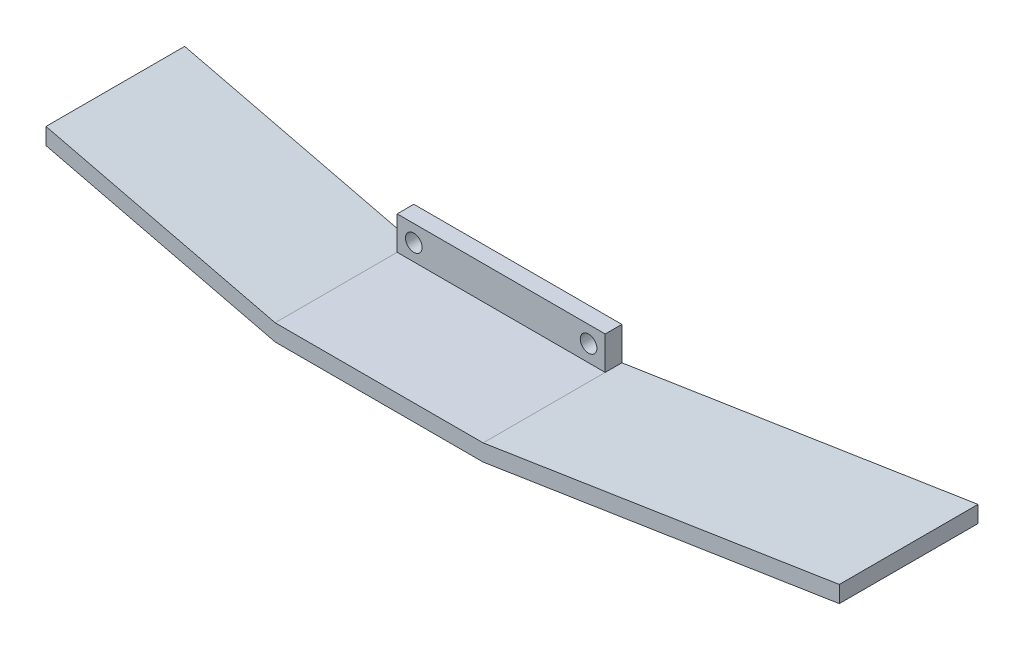
ISO-10303-21;
HEADER;
FILE_DESCRIPTION(('STEP AP214'),'2;1');
FILE_NAME('part.step','',(''),(''),'','','');
FILE_SCHEMA(('AUTOMOTIVE_DESIGN { 1 0 10303 214 1 1 1 1 }'));
ENDSEC;
DATA;
#1=APPLICATION_CONTEXT('core data for automotive mechanical design processes');
#2=APPLICATION_PROTOCOL_DEFINITION('international standard','automotive_design',2000,#1);
#3=PRODUCT_CONTEXT('',#1,'mechanical');
#4=PRODUCT('Part','Part','',(#3));
#5=PRODUCT_RELATED_PRODUCT_CATEGORY('part','',(#4));
#6=PRODUCT_DEFINITION_FORMATION('','',#4);
#7=PRODUCT_DEFINITION_CONTEXT('part definition',#1,'design');
#8=PRODUCT_DEFINITION('design','',#6,#7);
#9=PRODUCT_DEFINITION_SHAPE('','',#8);
#10=(LENGTH_UNIT() NAMED_UNIT(*) SI_UNIT(.MILLI.,.METRE.));
#11=(NAMED_UNIT(*) PLANE_ANGLE_UNIT() SI_UNIT($,.RADIAN.));
#12=(NAMED_UNIT(*) SI_UNIT($,.STERADIAN.) SOLID_ANGLE_UNIT());
#13=UNCERTAINTY_MEASURE_WITH_UNIT(LENGTH_MEASURE(1.E-05),#10,'distance_accuracy_value','');
#14=(GEOMETRIC_REPRESENTATION_CONTEXT(3) GLOBAL_UNCERTAINTY_ASSIGNED_CONTEXT((#13)) GLOBAL_UNIT_ASSIGNED_CONTEXT((#10,
#11,#12)) REPRESENTATION_CONTEXT('',''));
#15=CARTESIAN_POINT('',(0.,0.,0.));
#16=DIRECTION('',(0.,0.,1.));
#17=DIRECTION('',(1.,0.,0.));
#18=AXIS2_PLACEMENT_3D('',#15,#16,#17);
#19=CARTESIAN_POINT('',(101.7,4.70457006684912E-13,25.));
#20=DIRECTION('',(1.,0.,0.));
#21=DIRECTION('',(0.,1.,0.));
#22=AXIS2_PLACEMENT_3D('',#19,#20,#21);
#23=PLANE('',#22);
#24=DIRECTION('',(0.,-1.,0.));
#25=VECTOR('',#24,1.);
#26=CARTESIAN_POINT('',(101.7,4.70457006684912E-13,0.));
#27=LINE('',#26,#25);
#28=CARTESIAN_POINT('',(101.7,13.,0.));
#29=VERTEX_POINT('',#28);
#30=CARTESIAN_POINT('',(101.7,10.,0.));
#31=VERTEX_POINT('',#30);
#32=EDGE_CURVE('E133',#29,#31,#27,.T.);
#33=ORIENTED_EDGE('',*,*,#32,.F.);
#34=DIRECTION('',(0.,0.,-1.));
#35=VECTOR('',#34,1.);
#36=CARTESIAN_POINT('',(101.7,13.,25.));
#37=LINE('',#36,#35);
#38=CARTESIAN_POINT('',(101.7,13.,25.));
#39=VERTEX_POINT('',#38);
#40=EDGE_CURVE('E11',#39,#29,#37,.T.);
#41=ORIENTED_EDGE('',*,*,#40,.F.);
#42=DIRECTION('',(0.,-1.,0.));
#43=VECTOR('',#42,1.);
#44=CARTESIAN_POINT('',(101.7,4.70457006684912E-13,25.));
#45=LINE('',#44,#43);
#46=CARTESIAN_POINT('',(101.7,10.,25.));
#47=VERTEX_POINT('',#46);
#48=EDGE_CURVE('E149',#39,#47,#45,.T.);
#49=ORIENTED_EDGE('',*,*,#48,.T.);
#50=DIRECTION('',(0.,0.,-1.));
#51=VECTOR('',#50,1.);
#52=CARTESIAN_POINT('',(101.7,10.,25.));
#53=LINE('',#52,#51);
#54=EDGE_CURVE('E87',#47,#31,#53,.T.);
#55=ORIENTED_EDGE('',*,*,#54,.T.);
#56=EDGE_LOOP('',(#33,#41,#49,#55));
#57=FACE_BOUND('',#56,.T.);
#58=ADVANCED_FACE('F37',(#57),#23,.T.);
#59=CARTESIAN_POINT('',(0.432059578741914,-2.77382249552309,25.));
#60=DIRECTION('',(-0.153907364686392,0.988085281286636,0.));
#61=DIRECTION('',(-0.988085281286636,-0.153907364686392,0.));
#62=AXIS2_PLACEMENT_3D('',#59,#60,#61);
#63=PLANE('',#62);
#64=DIRECTION('',(0.988085281286636,0.153907364686392,0.));
#65=VECTOR('',#64,1.);
#66=CARTESIAN_POINT('',(0.432059578741914,-2.77382249552309,0.));
#67=LINE('',#66,#65);
#68=CARTESIAN_POINT('',(37.5,2.99999999999999,0.));
#69=VERTEX_POINT('',#68);
#70=EDGE_CURVE('E136',#69,#29,#67,.T.);
#71=ORIENTED_EDGE('',*,*,#70,.F.);
#72=DIRECTION('',(0.,0.,-1.));
#73=VECTOR('',#72,1.);
#74=CARTESIAN_POINT('',(37.5,2.99999999999999,3.));
#75=LINE('',#74,#73);
#76=CARTESIAN_POINT('',(37.5,2.99999999999999,3.));
#77=VERTEX_POINT('',#76);
#78=EDGE_CURVE('E200',#77,#69,#75,.T.);
#79=ORIENTED_EDGE('',*,*,#78,.F.);
#80=DIRECTION('',(0.,0.,-1.));
#81=VECTOR('',#80,1.);
#82=CARTESIAN_POINT('',(37.5,2.99999999999999,25.));
#83=LINE('',#82,#81);
#84=CARTESIAN_POINT('',(37.5,2.99999999999999,25.));
#85=VERTEX_POINT('',#84);
#86=EDGE_CURVE('E46',#85,#77,#83,.T.);
#87=ORIENTED_EDGE('',*,*,#86,.F.);
#88=DIRECTION('',(0.988085281286636,0.153907364686392,0.));
#89=VECTOR('',#88,1.);
#90=CARTESIAN_POINT('',(0.432059578741914,-2.77382249552309,25.));
#91=LINE('',#90,#89);
#92=EDGE_CURVE('E206',#85,#39,#91,.T.);
#93=ORIENTED_EDGE('',*,*,#92,.T.);
#94=ORIENTED_EDGE('',*,*,#40,.T.);
#95=EDGE_LOOP('',(#71,#79,#87,#93,#94));
#96=FACE_BOUND('',#95,.T.);
#97=ADVANCED_FACE('F228',(#96),#63,.T.);
#98=CARTESIAN_POINT('',(0.,2.99999999999999,25.));
#99=DIRECTION('',(0.,1.,0.));
#100=DIRECTION('',(0.,0.,1.));
#101=AXIS2_PLACEMENT_3D('',#98,#99,#100);
#102=PLANE('',#101);
#103=DIRECTION('',(1.,0.,0.));
#104=VECTOR('',#103,1.);
#105=CARTESIAN_POINT('',(0.,2.99999999999999,3.));
#106=LINE('',#105,#104);
#107=CARTESIAN_POINT('',(0.,2.99999999999999,3.));
#108=VERTEX_POINT('',#107);
#109=EDGE_CURVE('E178',#108,#77,#106,.T.);
#110=ORIENTED_EDGE('',*,*,#109,.F.);
#111=DIRECTION('',(0.,0.,-1.));
#112=VECTOR('',#111,1.);
#113=CARTESIAN_POINT('',(0.,2.99999999999999,25.));
#114=LINE('',#113,#112);
#115=CARTESIAN_POINT('',(0.,2.99999999999999,25.));
#116=VERTEX_POINT('',#115);
#117=EDGE_CURVE('E156',#116,#108,#114,.T.);
#118=ORIENTED_EDGE('',*,*,#117,.F.);
#119=DIRECTION('',(1.,0.,0.));
#120=VECTOR('',#119,1.);
#121=CARTESIAN_POINT('',(0.,2.99999999999999,25.));
#122=LINE('',#121,#120);
#123=EDGE_CURVE('E209',#116,#85,#122,.T.);
#124=ORIENTED_EDGE('',*,*,#123,.T.);
#125=ORIENTED_EDGE('',*,*,#86,.T.);
#126=EDGE_LOOP('',(#110,#118,#124,#125));
#127=FACE_BOUND('',#126,.T.);
#128=ADVANCED_FACE('F233',(#127),#102,.T.);
#129=CARTESIAN_POINT('',(0.686164291766578,2.83385852499597,25.));
#130=DIRECTION('',(-0.235330600789623,-0.971915381261144,0.));
#131=DIRECTION('',(0.971915381261144,-0.235330600789623,0.));
#132=AXIS2_PLACEMENT_3D('',#129,#130,#131);
#133=PLANE('',#132);
#134=DIRECTION('',(-0.971915381261144,0.235330600789623,0.));
#135=VECTOR('',#134,1.);
#136=CARTESIAN_POINT('',(0.686164291766578,2.83385852499597,0.));
#137=LINE('',#136,#135);
#138=CARTESIAN_POINT('',(0.,2.99999999999999,0.));
#139=VERTEX_POINT('',#138);
#140=CARTESIAN_POINT('',(-41.3000000000001,13.,0.));
#141=VERTEX_POINT('',#140);
#142=EDGE_CURVE('E140',#139,#141,#137,.T.);
#143=ORIENTED_EDGE('',*,*,#142,.T.);
#144=DIRECTION('',(0.,0.,-1.));
#145=VECTOR('',#144,1.);
#146=CARTESIAN_POINT('',(-41.3000000000001,13.,25.));
#147=LINE('',#146,#145);
#148=CARTESIAN_POINT('',(-41.3000000000001,13.,25.));
#149=VERTEX_POINT('',#148);
#150=EDGE_CURVE('E153',#149,#141,#147,.T.);
#151=ORIENTED_EDGE('',*,*,#150,.F.);
#152=DIRECTION('',(-0.971915381261144,0.235330600789623,0.));
#153=VECTOR('',#152,1.);
#154=CARTESIAN_POINT('',(0.686164291766578,2.83385852499597,25.));
#155=LINE('',#154,#153);
#156=EDGE_CURVE('E128',#116,#149,#155,.T.);
#157=ORIENTED_EDGE('',*,*,#156,.F.);
#158=ORIENTED_EDGE('',*,*,#117,.T.);
#159=DIRECTION('',(0.,0.,-1.));
#160=VECTOR('',#159,1.);
#161=CARTESIAN_POINT('',(0.,2.99999999999999,3.));
#162=LINE('',#161,#160);
#163=EDGE_CURVE('E137',#108,#139,#162,.T.);
#164=ORIENTED_EDGE('',*,*,#163,.T.);
#165=EDGE_LOOP('',(#143,#151,#157,#158,#164));
#166=FACE_BOUND('',#165,.T.);
#167=ADVANCED_FACE('F216',(#166),#133,.F.);
#168=CARTESIAN_POINT('',(-41.3,0.,25.));
#169=DIRECTION('',(1.,0.,0.));
#170=DIRECTION('',(0.,1.,0.));
#171=AXIS2_PLACEMENT_3D('',#168,#169,#170);
#172=PLANE('',#171);
#173=DIRECTION('',(0.,-1.,0.));
#174=VECTOR('',#173,1.);
#175=CARTESIAN_POINT('',(-41.3,0.,0.));
#176=LINE('',#175,#174);
#177=CARTESIAN_POINT('',(-41.3000000000001,10.,0.));
#178=VERTEX_POINT('',#177);
#179=EDGE_CURVE('E142',#141,#178,#176,.T.);
#180=ORIENTED_EDGE('',*,*,#179,.T.);
#181=DIRECTION('',(0.,0.,-1.));
#182=VECTOR('',#181,1.);
#183=CARTESIAN_POINT('',(-41.3000000000001,10.,25.));
#184=LINE('',#183,#182);
#185=CARTESIAN_POINT('',(-41.3000000000001,10.,25.));
#186=VERTEX_POINT('',#185);
#187=EDGE_CURVE('E117',#186,#178,#184,.T.);
#188=ORIENTED_EDGE('',*,*,#187,.F.);
#189=DIRECTION('',(0.,-1.,0.));
#190=VECTOR('',#189,1.);
#191=CARTESIAN_POINT('',(-41.3,0.,25.));
#192=LINE('',#191,#190);
#193=EDGE_CURVE('E125',#149,#186,#192,.T.);
#194=ORIENTED_EDGE('',*,*,#193,.F.);
#195=ORIENTED_EDGE('',*,*,#150,.T.);
#196=EDGE_LOOP('',(#180,#188,#194,#195));
#197=FACE_BOUND('',#196,.T.);
#198=ADVANCED_FACE('F220',(#197),#172,.F.);
#199=CARTESIAN_POINT('',(0.,0.,25.));
#200=DIRECTION('',(-0.235330600789623,-0.971915381261144,0.));
#201=DIRECTION('',(0.971915381261144,-0.235330600789623,0.));
#202=AXIS2_PLACEMENT_3D('',#199,#200,#201);
#203=PLANE('',#202);
#204=DIRECTION('',(-0.971915381261144,0.235330600789623,0.));
#205=VECTOR('',#204,1.);
#206=CARTESIAN_POINT('',(0.,0.,0.));
#207=LINE('',#206,#205);
#208=CARTESIAN_POINT('',(0.,0.,0.));
#209=VERTEX_POINT('',#208);
#210=EDGE_CURVE('E116',#209,#178,#207,.T.);
#211=ORIENTED_EDGE('',*,*,#210,.F.);
#212=DIRECTION('',(0.,0.,-1.));
#213=VECTOR('',#212,1.);
#214=CARTESIAN_POINT('',(0.,0.,25.));
#215=LINE('',#214,#213);
#216=CARTESIAN_POINT('',(0.,0.,25.));
#217=VERTEX_POINT('',#216);
#218=EDGE_CURVE('E110',#217,#209,#215,.T.);
#219=ORIENTED_EDGE('',*,*,#218,.F.);
#220=DIRECTION('',(-0.971915381261144,0.235330600789623,0.));
#221=VECTOR('',#220,1.);
#222=CARTESIAN_POINT('',(0.,0.,25.));
#223=LINE('',#222,#221);
#224=EDGE_CURVE('E114',#217,#186,#223,.T.);
#225=ORIENTED_EDGE('',*,*,#224,.T.);
#226=ORIENTED_EDGE('',*,*,#187,.T.);
#227=EDGE_LOOP('',(#211,#219,#225,#226));
#228=FACE_BOUND('',#227,.T.);
#229=ADVANCED_FACE('F112',(#228),#203,.T.);
#230=CARTESIAN_POINT('',(0.,0.,25.));
#231=DIRECTION('',(0.,1.,0.));
#232=DIRECTION('',(0.,0.,1.));
#233=AXIS2_PLACEMENT_3D('',#230,#231,#232);
#234=PLANE('',#233);
#235=DIRECTION('',(1.,0.,0.));
#236=VECTOR('',#235,1.);
#237=CARTESIAN_POINT('',(0.,0.,0.));
#238=LINE('',#237,#236);
#239=CARTESIAN_POINT('',(37.5,0.,0.));
#240=VERTEX_POINT('',#239);
#241=EDGE_CURVE('E80',#209,#240,#238,.T.);
#242=ORIENTED_EDGE('',*,*,#241,.T.);
#243=DIRECTION('',(0.,0.,-1.));
#244=VECTOR('',#243,1.);
#245=CARTESIAN_POINT('',(37.5,0.,25.));
#246=LINE('',#245,#244);
#247=CARTESIAN_POINT('',(37.5,0.,25.));
#248=VERTEX_POINT('',#247);
#249=EDGE_CURVE('E118',#248,#240,#246,.T.);
#250=ORIENTED_EDGE('',*,*,#249,.F.);
#251=DIRECTION('',(1.,0.,0.));
#252=VECTOR('',#251,1.);
#253=CARTESIAN_POINT('',(0.,0.,25.));
#254=LINE('',#253,#252);
#255=EDGE_CURVE('E120',#217,#248,#254,.T.);
#256=ORIENTED_EDGE('',*,*,#255,.F.);
#257=ORIENTED_EDGE('',*,*,#218,.T.);
#258=EDGE_LOOP('',(#242,#250,#256,#257));
#259=FACE_BOUND('',#258,.T.);
#260=ADVANCED_FACE('F121',(#259),#234,.F.);
#261=CARTESIAN_POINT('',(0.888280383926628,-5.70276006480894,25.));
#262=DIRECTION('',(-0.153907364686392,0.988085281286636,0.));
#263=DIRECTION('',(-0.988085281286636,-0.153907364686392,0.));
#264=AXIS2_PLACEMENT_3D('',#261,#262,#263);
#265=PLANE('',#264);
#266=DIRECTION('',(0.988085281286636,0.153907364686392,0.));
#267=VECTOR('',#266,1.);
#268=CARTESIAN_POINT('',(0.888280383926628,-5.70276006480894,0.));
#269=LINE('',#268,#267);
#270=EDGE_CURVE('E147',#240,#31,#269,.T.);
#271=ORIENTED_EDGE('',*,*,#270,.T.);
#272=ORIENTED_EDGE('',*,*,#54,.F.);
#273=DIRECTION('',(0.988085281286636,0.153907364686392,0.));
#274=VECTOR('',#273,1.);
#275=CARTESIAN_POINT('',(0.888280383926628,-5.70276006480894,25.));
#276=LINE('',#275,#274);
#277=EDGE_CURVE('E55',#248,#47,#276,.T.);
#278=ORIENTED_EDGE('',*,*,#277,.F.);
#279=ORIENTED_EDGE('',*,*,#249,.T.);
#280=EDGE_LOOP('',(#271,#272,#278,#279));
#281=FACE_BOUND('',#280,.T.);
#282=ADVANCED_FACE('F225',(#281),#265,.F.);
#283=CARTESIAN_POINT('',(0.,0.,25.));
#284=DIRECTION('',(0.,0.,1.));
#285=DIRECTION('',(1.,0.,0.));
#286=AXIS2_PLACEMENT_3D('',#283,#284,#285);
#287=PLANE('',#286);
#288=ORIENTED_EDGE('',*,*,#48,.F.);
#289=ORIENTED_EDGE('',*,*,#92,.F.);
#290=ORIENTED_EDGE('',*,*,#123,.F.);
#291=ORIENTED_EDGE('',*,*,#156,.T.);
#292=ORIENTED_EDGE('',*,*,#193,.T.);
#293=ORIENTED_EDGE('',*,*,#224,.F.);
#294=ORIENTED_EDGE('',*,*,#255,.T.);
#295=ORIENTED_EDGE('',*,*,#277,.T.);
#296=EDGE_LOOP('',(#288,#289,#290,#291,#292,#293,#294,#295));
#297=FACE_BOUND('',#296,.T.);
#298=ADVANCED_FACE('F123',(#297),#287,.T.);
#299=CARTESIAN_POINT('',(0.,0.,0.));
#300=DIRECTION('',(0.,0.,1.));
#301=DIRECTION('',(1.,0.,0.));
#302=AXIS2_PLACEMENT_3D('',#299,#300,#301);
#303=PLANE('',#302);
#304=CARTESIAN_POINT('',(3.,6.,0.));
#305=DIRECTION('',(0.,0.,-1.));
#306=DIRECTION('',(-1.,0.,0.));
#307=AXIS2_PLACEMENT_3D('',#304,#305,#306);
#308=CIRCLE('',#307,1.5);
#309=CARTESIAN_POINT('',(1.5,6.,0.));
#310=VERTEX_POINT('',#309);
#311=EDGE_CURVE('E162',#310,#310,#308,.T.);
#312=ORIENTED_EDGE('',*,*,#311,.F.);
#313=EDGE_LOOP('',(#312));
#314=FACE_BOUND('',#313,.T.);
#315=CARTESIAN_POINT('',(34.5,6.,0.));
#316=DIRECTION('',(0.,0.,-1.));
#317=DIRECTION('',(-1.,0.,0.));
#318=AXIS2_PLACEMENT_3D('',#315,#316,#317);
#319=CIRCLE('',#318,1.5);
#320=CARTESIAN_POINT('',(33.,6.,0.));
#321=VERTEX_POINT('',#320);
#322=EDGE_CURVE('E168',#321,#321,#319,.T.);
#323=ORIENTED_EDGE('',*,*,#322,.F.);
#324=EDGE_LOOP('',(#323));
#325=FACE_BOUND('',#324,.T.);
#326=ORIENTED_EDGE('',*,*,#32,.T.);
#327=ORIENTED_EDGE('',*,*,#270,.F.);
#328=ORIENTED_EDGE('',*,*,#241,.F.);
#329=ORIENTED_EDGE('',*,*,#210,.T.);
#330=ORIENTED_EDGE('',*,*,#179,.F.);
#331=ORIENTED_EDGE('',*,*,#142,.F.);
#332=DIRECTION('',(0.,1.,0.));
#333=VECTOR('',#332,1.);
#334=CARTESIAN_POINT('',(0.,0.,0.));
#335=LINE('',#334,#333);
#336=CARTESIAN_POINT('',(0.,9.,0.));
#337=VERTEX_POINT('',#336);
#338=EDGE_CURVE('E166',#139,#337,#335,.T.);
#339=ORIENTED_EDGE('',*,*,#338,.T.);
#340=DIRECTION('',(1.,0.,0.));
#341=VECTOR('',#340,1.);
#342=CARTESIAN_POINT('',(0.,9.,0.));
#343=LINE('',#342,#341);
#344=CARTESIAN_POINT('',(37.5,9.,0.));
#345=VERTEX_POINT('',#344);
#346=EDGE_CURVE('E179',#337,#345,#343,.T.);
#347=ORIENTED_EDGE('',*,*,#346,.T.);
#348=DIRECTION('',(0.,-1.,0.));
#349=VECTOR('',#348,1.);
#350=CARTESIAN_POINT('',(37.5,0.,0.));
#351=LINE('',#350,#349);
#352=EDGE_CURVE('E191',#345,#69,#351,.T.);
#353=ORIENTED_EDGE('',*,*,#352,.T.);
#354=ORIENTED_EDGE('',*,*,#70,.T.);
#355=EDGE_LOOP('',(#326,#327,#328,#329,#330,#331,#339,#347,#353,#354));
#356=FACE_BOUND('',#355,.T.);
#357=ADVANCED_FACE('F222',(#314,#325,#356),#303,.F.);
#358=CARTESIAN_POINT('',(0.,0.,3.));
#359=DIRECTION('',(-1.,0.,0.));
#360=DIRECTION('',(0.,-1.,0.));
#361=AXIS2_PLACEMENT_3D('',#358,#359,#360);
#362=PLANE('',#361);
#363=ORIENTED_EDGE('',*,*,#338,.F.);
#364=ORIENTED_EDGE('',*,*,#163,.F.);
#365=DIRECTION('',(0.,1.,0.));
#366=VECTOR('',#365,1.);
#367=CARTESIAN_POINT('',(0.,0.,3.));
#368=LINE('',#367,#366);
#369=CARTESIAN_POINT('',(0.,9.,3.));
#370=VERTEX_POINT('',#369);
#371=EDGE_CURVE('E175',#108,#370,#368,.T.);
#372=ORIENTED_EDGE('',*,*,#371,.T.);
#373=DIRECTION('',(0.,0.,-1.));
#374=VECTOR('',#373,1.);
#375=CARTESIAN_POINT('',(0.,9.,3.));
#376=LINE('',#375,#374);
#377=EDGE_CURVE('E188',#370,#337,#376,.T.);
#378=ORIENTED_EDGE('',*,*,#377,.T.);
#379=EDGE_LOOP('',(#363,#364,#372,#378));
#380=FACE_BOUND('',#379,.T.);
#381=ADVANCED_FACE('F254',(#380),#362,.T.);
#382=CARTESIAN_POINT('',(37.5,0.,3.));
#383=DIRECTION('',(1.,0.,0.));
#384=DIRECTION('',(0.,1.,0.));
#385=AXIS2_PLACEMENT_3D('',#382,#383,#384);
#386=PLANE('',#385);
#387=ORIENTED_EDGE('',*,*,#352,.F.);
#388=DIRECTION('',(0.,0.,-1.));
#389=VECTOR('',#388,1.);
#390=CARTESIAN_POINT('',(37.5,9.,3.));
#391=LINE('',#390,#389);
#392=CARTESIAN_POINT('',(37.5,9.,3.));
#393=VERTEX_POINT('',#392);
#394=EDGE_CURVE('E197',#393,#345,#391,.T.);
#395=ORIENTED_EDGE('',*,*,#394,.F.);
#396=DIRECTION('',(0.,-1.,0.));
#397=VECTOR('',#396,1.);
#398=CARTESIAN_POINT('',(37.5,0.,3.));
#399=LINE('',#398,#397);
#400=EDGE_CURVE('E182',#393,#77,#399,.T.);
#401=ORIENTED_EDGE('',*,*,#400,.T.);
#402=ORIENTED_EDGE('',*,*,#78,.T.);
#403=EDGE_LOOP('',(#387,#395,#401,#402));
#404=FACE_BOUND('',#403,.T.);
#405=ADVANCED_FACE('F259',(#404),#386,.T.);
#406=CARTESIAN_POINT('',(0.,9.,3.));
#407=DIRECTION('',(0.,1.,0.));
#408=DIRECTION('',(0.,0.,1.));
#409=AXIS2_PLACEMENT_3D('',#406,#407,#408);
#410=PLANE('',#409);
#411=ORIENTED_EDGE('',*,*,#346,.F.);
#412=ORIENTED_EDGE('',*,*,#377,.F.);
#413=DIRECTION('',(1.,0.,0.));
#414=VECTOR('',#413,1.);
#415=CARTESIAN_POINT('',(0.,9.,3.));
#416=LINE('',#415,#414);
#417=EDGE_CURVE('E185',#370,#393,#416,.T.);
#418=ORIENTED_EDGE('',*,*,#417,.T.);
#419=ORIENTED_EDGE('',*,*,#394,.T.);
#420=EDGE_LOOP('',(#411,#412,#418,#419));
#421=FACE_BOUND('',#420,.T.);
#422=ADVANCED_FACE('F256',(#421),#410,.T.);
#423=CARTESIAN_POINT('',(0.,0.,3.));
#424=DIRECTION('',(0.,0.,1.));
#425=DIRECTION('',(1.,0.,0.));
#426=AXIS2_PLACEMENT_3D('',#423,#424,#425);
#427=PLANE('',#426);
#428=CARTESIAN_POINT('',(3.,6.,3.));
#429=DIRECTION('',(0.,0.,1.));
#430=DIRECTION('',(1.,0.,0.));
#431=AXIS2_PLACEMENT_3D('',#428,#429,#430);
#432=CIRCLE('',#431,1.5);
#433=CARTESIAN_POINT('',(4.5,6.,3.));
#434=VERTEX_POINT('',#433);
#435=EDGE_CURVE('E40',#434,#434,#432,.T.);
#436=ORIENTED_EDGE('',*,*,#435,.F.);
#437=EDGE_LOOP('',(#436));
#438=FACE_BOUND('',#437,.T.);
#439=CARTESIAN_POINT('',(34.5,6.,3.));
#440=DIRECTION('',(0.,0.,1.));
#441=DIRECTION('',(1.,0.,0.));
#442=AXIS2_PLACEMENT_3D('',#439,#440,#441);
#443=CIRCLE('',#442,1.5);
#444=CARTESIAN_POINT('',(36.,6.,3.));
#445=VERTEX_POINT('',#444);
#446=EDGE_CURVE('E160',#445,#445,#443,.T.);
#447=ORIENTED_EDGE('',*,*,#446,.F.);
#448=EDGE_LOOP('',(#447));
#449=FACE_BOUND('',#448,.T.);
#450=ORIENTED_EDGE('',*,*,#371,.F.);
#451=ORIENTED_EDGE('',*,*,#109,.T.);
#452=ORIENTED_EDGE('',*,*,#400,.F.);
#453=ORIENTED_EDGE('',*,*,#417,.F.);
#454=EDGE_LOOP('',(#450,#451,#452,#453));
#455=FACE_BOUND('',#454,.T.);
#456=ADVANCED_FACE('F258',(#438,#449,#455),#427,.T.);
#457=CARTESIAN_POINT('',(34.5,6.,4.));
#458=DIRECTION('',(0.,0.,-1.));
#459=DIRECTION('',(-1.,0.,0.));
#460=AXIS2_PLACEMENT_3D('',#457,#458,#459);
#461=CYLINDRICAL_SURFACE('',#460,1.5);
#462=ORIENTED_EDGE('',*,*,#446,.T.);
#463=EDGE_LOOP('',(#462));
#464=FACE_BOUND('',#463,.T.);
#465=ORIENTED_EDGE('',*,*,#322,.T.);
#466=EDGE_LOOP('',(#465));
#467=FACE_BOUND('',#466,.T.);
#468=ADVANCED_FACE('F265',(#464,#467),#461,.F.);
#469=CARTESIAN_POINT('',(3.,6.,4.));
#470=DIRECTION('',(0.,0.,-1.));
#471=DIRECTION('',(-1.,0.,0.));
#472=AXIS2_PLACEMENT_3D('',#469,#470,#471);
#473=CYLINDRICAL_SURFACE('',#472,1.5);
#474=ORIENTED_EDGE('',*,*,#435,.T.);
#475=EDGE_LOOP('',(#474));
#476=FACE_BOUND('',#475,.T.);
#477=ORIENTED_EDGE('',*,*,#311,.T.);
#478=EDGE_LOOP('',(#477));
#479=FACE_BOUND('',#478,.T.);
#480=ADVANCED_FACE('F328',(#476,#479),#473,.F.);
#481=CLOSED_SHELL('',(#58,#97,#128,#167,#198,#229,#260,#282,#298,#357,#381,#405,#422,#456,#468,#480));
#482=MANIFOLD_SOLID_BREP('B2',#481);
#483=ADVANCED_BREP_SHAPE_REPRESENTATION('',(#18,#482),#14);
#484=SHAPE_DEFINITION_REPRESENTATION(#9,#483);
ENDSEC;
END-ISO-10303-21;
